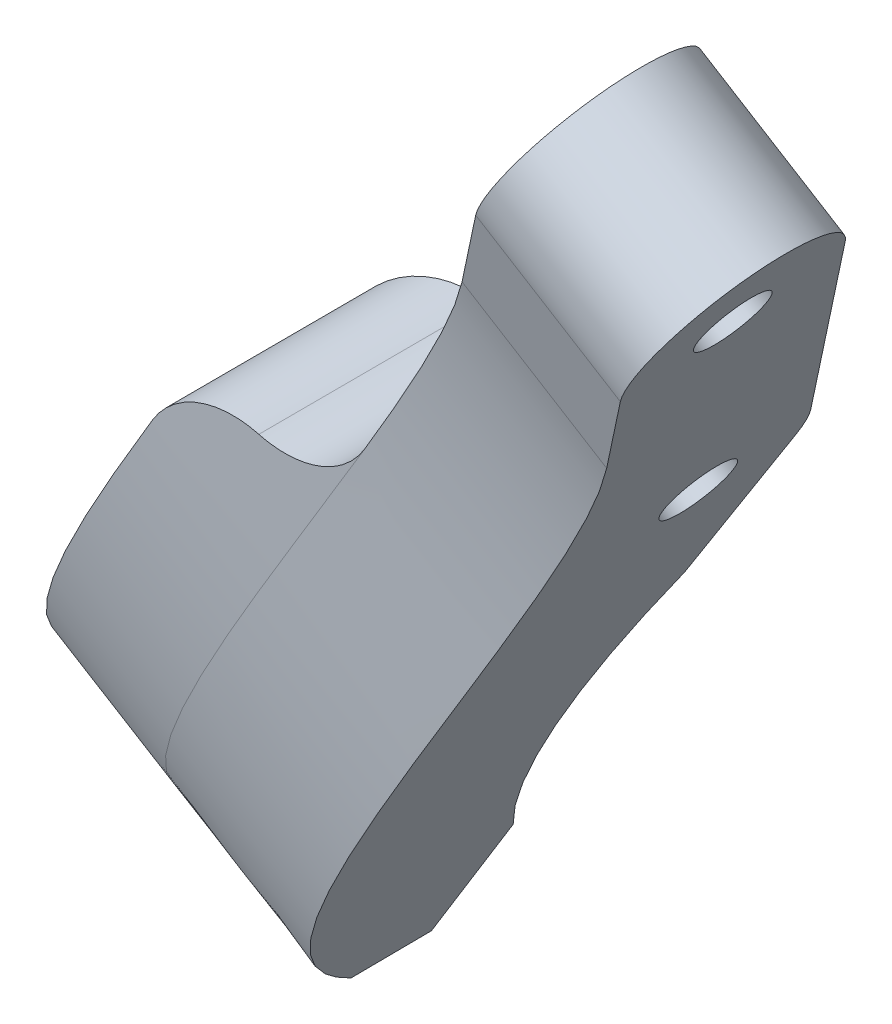
ISO-10303-21;
HEADER;
FILE_DESCRIPTION(('STEP AP214'),'2;1');
FILE_NAME('part.step','',(''),(''),'','','');
FILE_SCHEMA(('AUTOMOTIVE_DESIGN { 1 0 10303 214 1 1 1 1 }'));
ENDSEC;
DATA;
#1=APPLICATION_CONTEXT('core data for automotive mechanical design processes');
#2=APPLICATION_PROTOCOL_DEFINITION('international standard','automotive_design',2000,#1);
#3=PRODUCT_CONTEXT('',#1,'mechanical');
#4=PRODUCT('Part','Part','',(#3));
#5=PRODUCT_RELATED_PRODUCT_CATEGORY('part','',(#4));
#6=PRODUCT_DEFINITION_FORMATION('','',#4);
#7=PRODUCT_DEFINITION_CONTEXT('part definition',#1,'design');
#8=PRODUCT_DEFINITION('design','',#6,#7);
#9=PRODUCT_DEFINITION_SHAPE('','',#8);
#10=(LENGTH_UNIT() NAMED_UNIT(*) SI_UNIT(.MILLI.,.METRE.));
#11=(NAMED_UNIT(*) PLANE_ANGLE_UNIT() SI_UNIT($,.RADIAN.));
#12=(NAMED_UNIT(*) SI_UNIT($,.STERADIAN.) SOLID_ANGLE_UNIT());
#13=UNCERTAINTY_MEASURE_WITH_UNIT(LENGTH_MEASURE(1.E-05),#10,'distance_accuracy_value','');
#14=(GEOMETRIC_REPRESENTATION_CONTEXT(3) GLOBAL_UNCERTAINTY_ASSIGNED_CONTEXT((#13)) GLOBAL_UNIT_ASSIGNED_CONTEXT((#10,
#11,#12)) REPRESENTATION_CONTEXT('',''));
#15=CARTESIAN_POINT('',(0.,0.,0.));
#16=DIRECTION('',(0.,0.,1.));
#17=DIRECTION('',(1.,0.,0.));
#18=AXIS2_PLACEMENT_3D('',#15,#16,#17);
#19=CARTESIAN_POINT('',(-130.554200433423,239.583217904642,122.671598751992));
#20=DIRECTION('',(-0.849388113162932,0.527762814669667,0.00249893366544723));
#21=DIRECTION('',(-0.211719550798936,-0.345073678716443,0.914384485906557));
#22=AXIS2_PLACEMENT_3D('',#19,#20,#21);
#23=PLANE('',#22);
#24=CARTESIAN_POINT('',(-154.013629575992,202.003501121946,85.4624671745819));
#25=DIRECTION('',(-0.849388113162932,0.527762814669667,0.00249893366544723));
#26=DIRECTION('',(-0.527764462529552,-0.84939076524936,0.));
#27=AXIS2_PLACEMENT_3D('',#24,#25,#26);
#28=CIRCLE('',#27,27.2604474324299);
#29=CARTESIAN_POINT('',(-160.911886497136,190.788337321939,109.332241924361));
#30=VERTEX_POINT('',#29);
#31=CARTESIAN_POINT('',(-156.156011352684,198.427965741754,112.402358437988));
#32=VERTEX_POINT('',#31);
#33=EDGE_CURVE('E199',#30,#32,#28,.T.);
#34=ORIENTED_EDGE('',*,*,#33,.F.);
#35=CARTESIAN_POINT('',(-160.911886497136,190.788337321939,109.332241924361));
#36=CARTESIAN_POINT('',(-159.236040593308,193.47744565111,111.025848084402));
#37=CARTESIAN_POINT('',(-157.458225846282,196.333368920378,112.14817097708));
#38=CARTESIAN_POINT('',(-155.573098384083,199.365411386922,112.550579356969));
#39=CARTESIAN_POINT('',(-153.684828730079,202.402507760526,112.953658484243));
#40=CARTESIAN_POINT('',(-151.818579185044,205.407715938208,112.606731798949));
#41=CARTESIAN_POINT('',(-149.987586104914,208.359002102272,111.664195657152));
#42=(BOUNDED_CURVE() B_SPLINE_CURVE(3,(#35,#36,#37,#38,#39,#40,#41),.UNSPECIFIED.,.F.,
.F.) B_SPLINE_CURVE_WITH_KNOTS((4,3,4),(0.,1.07783386624527,2.1574643010566),
.UNSPECIFIED.) CURVE() GEOMETRIC_REPRESENTATION_ITEM() RATIONAL_B_SPLINE_CURVE((1.,1.,1.,1.,1.,
1.,1.)) REPRESENTATION_ITEM(''));
#43=EDGE_CURVE('E227',#30,#32,#42,.T.);
#44=ORIENTED_EDGE('',*,*,#43,.T.);
#45=EDGE_LOOP('',(#34,#44));
#46=FACE_BOUND('',#45,.T.);
#47=ADVANCED_FACE('F53',(#46),#23,.F.);
#48=CARTESIAN_POINT('',(-155.270675856665,199.851858432794,112.608779310906));
#49=VERTEX_POINT('',#48);
#50=CARTESIAN_POINT('',(-149.987586104914,208.359002102272,111.664195657152));
#51=VERTEX_POINT('',#50);
#52=EDGE_CURVE('E218',#49,#51,#28,.T.);
#53=ORIENTED_EDGE('',*,*,#52,.F.);
#54=EDGE_CURVE('E192',#49,#51,#42,.T.);
#55=ORIENTED_EDGE('',*,*,#54,.T.);
#56=EDGE_LOOP('',(#53,#55));
#57=FACE_BOUND('',#56,.T.);
#58=ADVANCED_FACE('F452',(#57),#23,.F.);
#59=CARTESIAN_POINT('',(-190.286535692415,120.853212919488,33.8639850190344));
#60=CARTESIAN_POINT('',(-213.300316608428,135.152704052225,33.9316924792743));
#61=CARTESIAN_POINT('',(-178.471410495353,139.743447872602,60.3005928424088));
#62=CARTESIAN_POINT('',(-201.485191411364,154.042939005339,60.3683003026487));
#63=CARTESIAN_POINT('',(-166.65628529829,158.633682825716,86.7372006657834));
#64=CARTESIAN_POINT('',(-189.670066214302,172.933173958453,86.8049081260233));
#65=CARTESIAN_POINT('',(-154.841160101227,177.523917778831,113.173808489158));
#66=CARTESIAN_POINT('',(-177.854941017239,191.823408911568,113.241515949398));
#67=CARTESIAN_POINT('',(-148.064406128636,188.358714078198,128.336947609632));
#68=CARTESIAN_POINT('',(-171.078187044648,202.658205210935,128.404655069871));
#69=CARTESIAN_POINT('',(-137.368955526914,205.615317408969,119.211079333427));
#70=CARTESIAN_POINT('',(-160.382736442926,219.914808541706,119.278786793667));
#71=CARTESIAN_POINT('',(-128.974353554221,219.092409887209,126.240825941922));
#72=CARTESIAN_POINT('',(-151.988134470234,233.391901019946,126.308533402162));
#73=(BOUNDED_SURFACE() B_SPLINE_SURFACE(3,1,((#59,#60),(#61,#62),(#63,#64),(#65,#66),(#67,#68),
(#69,#70),(#71,#72)),.UNSPECIFIED.,.F.,.F.,.F.) B_SPLINE_SURFACE_WITH_KNOTS((4,3,4),(2,2),
(-1.74347855106593,0.,1.),(-0.364727041196335,2.34472704220426),
.UNSPECIFIED.) GEOMETRIC_REPRESENTATION_ITEM() RATIONAL_B_SPLINE_SURFACE(((1.,1.),(1.,1.),(1.,
1.),(1.,1.),(1.,1.),(1.,1.),(1.,1.))) REPRESENTATION_ITEM('') SURFACE());
#74=CARTESIAN_POINT('',(-165.15890719653,183.934795401992,113.20416371212));
#75=CARTESIAN_POINT('',(-158.38215322394,194.769591701358,128.367302832613));
#76=CARTESIAN_POINT('',(-147.686702622214,212.026195032136,119.2414345564));
#77=CARTESIAN_POINT('',(-139.292100649519,225.503287510381,126.271181164898));
#78=(BOUNDED_CURVE() B_SPLINE_CURVE(3,(#74,#75,#76,#77),.UNSPECIFIED.,.F.,
.F.) B_SPLINE_CURVE_WITH_KNOTS((4,4),(10.3495563579461,25.5795672564202),
.UNSPECIFIED.) CURVE() GEOMETRIC_REPRESENTATION_ITEM() RATIONAL_B_SPLINE_CURVE((1.,1.,1.,1.)) REPRESENTATION_ITEM(''));
#79=CARTESIAN_POINT('',(-165.158907196524,183.934795402002,113.204163712134));
#80=VERTEX_POINT('',#79);
#81=CARTESIAN_POINT('',(-147.213857505538,212.768341934899,123.223726407014));
#82=VERTEX_POINT('',#81);
#83=EDGE_CURVE('E183',#80,#82,#78,.T.);
#84=CARTESIAN_POINT('',(-147.213857505537,212.768341934899,123.223726407014));
#85=CARTESIAN_POINT('',(-147.283850944044,212.655729661432,123.216113457687));
#86=CARTESIAN_POINT('',(-147.358301491458,212.54593291806,123.208758676163));
#87=CARTESIAN_POINT('',(-147.437035825369,212.439213445033,123.201658983338));
#88=CARTESIAN_POINT('',(-147.547912519714,212.288927009578,123.191660924903));
#89=CARTESIAN_POINT('',(-147.667133782602,212.144947547271,123.182182592419));
#90=CARTESIAN_POINT('',(-147.794146846982,212.007956571452,123.173200445009));
#91=CARTESIAN_POINT('',(-148.057872318591,211.723513314528,123.154550229196));
#92=CARTESIAN_POINT('',(-148.353849597899,211.470645871667,123.138133467725));
#93=CARTESIAN_POINT('',(-148.676147741597,211.254504774682,123.123604922473));
#94=CARTESIAN_POINT('',(-148.864596383759,211.128126459948,123.115110040702));
#95=CARTESIAN_POINT('',(-149.061169255766,211.014889810182,123.107298630019));
#96=CARTESIAN_POINT('',(-149.264444247249,210.915471379315,123.100092459311));
#97=CARTESIAN_POINT('',(-149.520543612538,210.790217422312,123.091013645773));
#98=CARTESIAN_POINT('',(-149.787280670521,210.686897178509,123.082893392063));
#99=CARTESIAN_POINT('',(-150.061819841548,210.606850059679,123.075619038334));
#100=CARTESIAN_POINT('',(-150.263541683566,210.548034218581,123.070274096014));
#101=CARTESIAN_POINT('',(-150.468520719753,210.50206172788,123.065411972324));
#102=CARTESIAN_POINT('',(-150.67551928881,210.469112612225,123.060996099036));
#103=CARTESIAN_POINT('',(-150.943977606605,210.426380605901,123.055269112999));
#104=CARTESIAN_POINT('',(-151.215832583991,210.40555379773,123.050291451282));
#105=CARTESIAN_POINT('',(-151.488390825583,210.40701437856,123.046028401059));
#106=CARTESIAN_POINT('',(-151.590502852519,210.407561574888,123.044431279296));
#107=CARTESIAN_POINT('',(-151.692503192694,210.411235998584,123.042938217383));
#108=CARTESIAN_POINT('',(-151.794249479963,210.418019740108,123.041547741427));
#109=CARTESIAN_POINT('',(-152.101362153134,210.438495897512,123.037350705846));
#110=CARTESIAN_POINT('',(-152.406159942504,210.487300963743,123.034084806528));
#111=CARTESIAN_POINT('',(-152.704730996739,210.563936997407,123.031746510106));
#112=(BOUNDED_CURVE() B_SPLINE_CURVE(3,(#84,#85,#86,#87,#88,#89,#90,#91,#92,#93,#94,#95,#96,#97,
#98,#99,#100,#101,#102,#103,#104,#105,#106,#107,#108,#109,#110,#111),.UNSPECIFIED.,.F.,
.F.) B_SPLINE_CURVE_WITH_KNOTS((4,3,3,3,3,3,3,3,3,4),(0.,0.0398430750700399,0.0959516142144151,
0.212453416759666,0.280572352373927,0.366393121804467,0.429451240717555,0.511231885887073,
0.541870429024245,0.634350313426785),
.UNSPECIFIED.) CURVE() GEOMETRIC_REPRESENTATION_ITEM() RATIONAL_B_SPLINE_CURVE((1.,1.,1.,1.,1.,
1.,1.,1.,1.,1.,1.,1.,1.,1.,1.,1.,1.,1.,1.,1.,1.,1.,1.,1.,1.,1.,1.,1.)) REPRESENTATION_ITEM(''));
#113=CARTESIAN_POINT('',(-152.704730996742,210.563936997408,123.031746510392));
#114=VERTEX_POINT('',#113);
#115=EDGE_CURVE('E316',#82,#114,#112,.T.);
#116=CARTESIAN_POINT('',(-158.195521071434,208.359557555514,122.862755524075));
#117=CARTESIAN_POINT('',(-158.087308357932,208.533670033716,122.872560096532));
#118=CARTESIAN_POINT('',(-157.968482703931,208.70098362137,122.881868221142));
#119=CARTESIAN_POINT('',(-157.839709468994,208.860547216873,122.890704924665));
#120=CARTESIAN_POINT('',(-157.661579320297,209.081269224883,122.902928608517));
#121=CARTESIAN_POINT('',(-157.464975130459,209.286467224217,122.914212644109));
#122=CARTESIAN_POINT('',(-157.252010304201,209.473908424981,122.924668332394));
#123=CARTESIAN_POINT('',(-157.028176928399,209.670915590288,122.935657621311));
#124=CARTESIAN_POINT('',(-156.78752724675,209.847201014708,122.945674177647));
#125=CARTESIAN_POINT('',(-156.533077814096,210.000863032419,122.954865731074));
#126=CARTESIAN_POINT('',(-156.319930686962,210.129582586961,122.962565308891));
#127=CARTESIAN_POINT('',(-156.097100247072,210.242427014383,122.969685907795));
#128=CARTESIAN_POINT('',(-155.86635687748,210.33828308965,122.976286054269));
#129=CARTESIAN_POINT('',(-155.621772867197,210.439888883743,122.983282096219));
#130=CARTESIAN_POINT('',(-155.370037462378,210.521686416567,122.989645040334));
#131=CARTESIAN_POINT('',(-155.11359653021,210.583160726023,122.995424971684));
#132=CARTESIAN_POINT('',(-154.843240414527,210.647970798962,123.001518537853));
#133=CARTESIAN_POINT('',(-154.567654269078,210.690192186124,123.006963928807));
#134=CARTESIAN_POINT('',(-154.289695315566,210.709235894572,123.011763291294));
#135=CARTESIAN_POINT('',(-154.192777716678,210.715875977482,123.013436713512));
#136=CARTESIAN_POINT('',(-154.095571568018,210.719698360453,123.015031131248));
#137=CARTESIAN_POINT('',(-153.998197756759,210.720678454418,123.016545271511));
#138=CARTESIAN_POINT('',(-153.663352941678,210.724048758796,123.021752031006));
#139=CARTESIAN_POINT('',(-153.329823636126,210.693770819985,123.025962582469));
#140=CARTESIAN_POINT('',(-153.002562319212,210.630764953076,123.02913468283));
#141=CARTESIAN_POINT('',(-152.902654235972,210.611530185414,123.030103078576));
#142=CARTESIAN_POINT('',(-152.803330230266,210.589245355389,123.030974326721));
#143=CARTESIAN_POINT('',(-152.704730996739,210.563936997407,123.031746510106));
#144=(BOUNDED_CURVE() B_SPLINE_CURVE(3,(#116,#117,#118,#119,#120,#121,#122,#123,#124,#125,#126,
#127,#128,#129,#130,#131,#132,#133,#134,#135,#136,#137,#138,#139,#140,#141,#142,#143),
.UNSPECIFIED.,.F.,.F.) B_SPLINE_CURVE_WITH_KNOTS((4,3,3,3,3,3,3,3,3,4),(0.,0.0615704056046904,
0.146739854915798,0.23625588293517,0.311241643389466,0.39072526208924,0.474521878449434,
0.503739742274043,0.604212904468515,0.634885888206467),
.UNSPECIFIED.) CURVE() GEOMETRIC_REPRESENTATION_ITEM() RATIONAL_B_SPLINE_CURVE((1.,1.,1.,1.,1.,
1.,1.,1.,1.,1.,1.,1.,1.,1.,1.,1.,1.,1.,1.,1.,1.,1.,1.,1.,1.,1.,1.,1.)) REPRESENTATION_ITEM(''));
#145=CARTESIAN_POINT('',(-158.195521071451,208.359557555488,122.862755524073));
#146=VERTEX_POINT('',#145);
#147=EDGE_CURVE('E310',#146,#114,#144,.T.);
#148=CARTESIAN_POINT('',(-158.19552107145,208.359557555489,122.862755524073));
#149=CARTESIAN_POINT('',(-162.976010231635,200.667829035189,122.429621090652));
#150=CARTESIAN_POINT('',(-167.572574565613,193.276239333769,121.124696110052));
#151=CARTESIAN_POINT('',(-171.104623988664,187.62913510469,113.221656247792));
#152=(BOUNDED_CURVE() B_SPLINE_CURVE(3,(#148,#149,#150,#151),.UNSPECIFIED.,.F.,
.F.) B_SPLINE_CURVE_WITH_KNOTS((4,4),(2.48893102353375,5.55049235151534),
.UNSPECIFIED.) CURVE() GEOMETRIC_REPRESENTATION_ITEM() RATIONAL_B_SPLINE_CURVE((1.,1.,1.,1.)) REPRESENTATION_ITEM(''));
#153=CARTESIAN_POINT('',(-171.104623988664,187.62913510469,113.221656247792));
#154=VERTEX_POINT('',#153);
#155=EDGE_CURVE('E342',#146,#154,#152,.T.);
#156=DIRECTION('',(-0.849388113162932,0.527762814669667,0.00249893366544723));
#157=VECTOR('',#156,1.);
#158=CARTESIAN_POINT('',(-157.939108234639,179.448811477309,113.182922775977));
#159=LINE('',#158,#157);
#160=EDGE_CURVE('E223',#80,#154,#159,.T.);
#161=ORIENTED_EDGE('',*,*,#83,.T.);
#162=ORIENTED_EDGE('',*,*,#115,.T.);
#163=ORIENTED_EDGE('',*,*,#147,.F.);
#164=ORIENTED_EDGE('',*,*,#155,.T.);
#165=ORIENTED_EDGE('',*,*,#160,.F.);
#166=EDGE_LOOP('',(#161,#162,#163,#164,#165));
#167=FACE_BOUND('',#166,.T.);
#168=ADVANCED_FACE('F390',(#167),#73,.T.);
#169=CARTESIAN_POINT('',(-157.992101957811,179.323652955737,121.603224355627));
#170=DIRECTION('',(-0.527731214315172,-0.849261757925097,-0.0159446531291126));
#171=DIRECTION('',(0.849388113162932,-0.527762814669667,-0.00249893366544723));
#172=AXIS2_PLACEMENT_3D('',#169,#170,#171);
#173=PLANE('',#172);
#174=DIRECTION('',(-0.849388113162932,0.527762814669667,0.00249893366544723));
#175=VECTOR('',#174,1.);
#176=CARTESIAN_POINT('',(-157.913937249772,179.508259333846,109.183443763172));
#177=LINE('',#176,#175);
#178=CARTESIAN_POINT('',(-157.913937249779,179.508259333836,109.183443763171));
#179=VERTEX_POINT('',#178);
#180=CARTESIAN_POINT('',(-171.079453003797,187.688582961226,109.222177234986));
#181=VERTEX_POINT('',#180);
#182=EDGE_CURVE('E164',#179,#181,#177,.T.);
#183=ORIENTED_EDGE('',*,*,#182,.F.);
#184=DIRECTION('',(0.00629274621669123,0.0148619641341267,-0.99986975320145));
#185=VECTOR('',#184,1.);
#186=CARTESIAN_POINT('',(-157.913937249779,179.508259333836,109.183443763171));
#187=LINE('',#186,#185);
#188=CARTESIAN_POINT('',(-157.939108234646,179.4488114773,113.182922775964));
#189=VERTEX_POINT('',#188);
#190=EDGE_CURVE('E157',#189,#179,#187,.T.);
#191=ORIENTED_EDGE('',*,*,#190,.F.);
#192=DIRECTION('',(-0.849388113162932,0.527762814669667,0.00249893366544723));
#193=VECTOR('',#192,1.);
#194=CARTESIAN_POINT('',(-157.939108234646,179.4488114773,113.182922775964));
#195=LINE('',#194,#193);
#196=EDGE_CURVE('E162',#189,#80,#195,.T.);
#197=ORIENTED_EDGE('',*,*,#196,.T.);
#198=ORIENTED_EDGE('',*,*,#160,.T.);
#199=DIRECTION('',(-0.00629274621669648,-0.0148619641341345,0.99986975320145));
#200=VECTOR('',#199,1.);
#201=CARTESIAN_POINT('',(-171.079228453541,187.68911329532,109.186497898481));
#202=LINE('',#201,#200);
#203=EDGE_CURVE('E268',#181,#154,#202,.T.);
#204=ORIENTED_EDGE('',*,*,#203,.F.);
#205=EDGE_LOOP('',(#183,#191,#197,#198,#204));
#206=FACE_BOUND('',#205,.T.);
#207=ADVANCED_FACE('F161',(#206),#173,.T.);
#208=CARTESIAN_POINT('',(-123.2562367635,235.281840358059,110.230577223381));
#209=DIRECTION('',(0.00629274621669601,0.0148619641341338,-0.99986975320145));
#210=DIRECTION('',(-0.527731214315172,-0.849261757925097,-0.0159446531291126));
#211=AXIS2_PLACEMENT_3D('',#208,#209,#210);
#212=PLANE('',#211);
#213=DIRECTION('',(0.849388113162934,-0.527762814669664,-0.00249893366545467));
#214=VECTOR('',#213,1.);
#215=CARTESIAN_POINT('',(-154.541475648414,186.830116211917,109.31349992187));
#216=LINE('',#215,#214);
#217=CARTESIAN_POINT('',(-166.857603289276,194.482677024626,109.349734460019));
#218=VERTEX_POINT('',#217);
#219=EDGE_CURVE('E329',#218,#30,#216,.T.);
#220=ORIENTED_EDGE('',*,*,#219,.T.);
#221=DIRECTION('',(-0.849388113162932,0.527762814669667,0.00249893366544723));
#222=VECTOR('',#221,1.);
#223=CARTESIAN_POINT('',(-153.692087535251,186.302353397247,109.311000988204));
#224=LINE('',#223,#222);
#225=CARTESIAN_POINT('',(-153.692087535251,186.302353397247,109.311000988204));
#226=VERTEX_POINT('',#225);
#227=EDGE_CURVE('E189',#226,#30,#224,.T.);
#228=ORIENTED_EDGE('',*,*,#227,.F.);
#229=DIRECTION('',(0.527731214315173,0.849261757925097,0.0159446531291005));
#230=VECTOR('',#229,1.);
#231=CARTESIAN_POINT('',(-153.692087535251,186.302353397247,109.311000988204));
#232=LINE('',#231,#230);
#233=EDGE_CURVE('E166',#179,#226,#232,.T.);
#234=ORIENTED_EDGE('',*,*,#233,.F.);
#235=ORIENTED_EDGE('',*,*,#182,.T.);
#236=DIRECTION('',(-0.527731214315173,-0.849261757925096,-0.0159446531291126));
#237=VECTOR('',#236,1.);
#238=CARTESIAN_POINT('',(-151.550922225677,219.115252311915,109.812204205027));
#239=LINE('',#238,#237);
#240=EDGE_CURVE('E269',#218,#181,#239,.T.);
#241=ORIENTED_EDGE('',*,*,#240,.F.);
#242=EDGE_LOOP('',(#220,#228,#234,#235,#241));
#243=FACE_BOUND('',#242,.T.);
#244=ADVANCED_FACE('F404',(#243),#212,.T.);
#245=CARTESIAN_POINT('',(-123.588825293944,234.745940403261,110.363163452912));
#246=DIRECTION('',(-0.0206935315705588,-0.0285724216035948,-0.999377503486468));
#247=DIRECTION('',(-0.527362883571315,-0.848911083786552,0.0351903517415067));
#248=AXIS2_PLACEMENT_3D('',#245,#246,#247);
#249=PLANE('',#248);
#250=DIRECTION('',(0.527362883571316,0.848911083786551,-0.0351903517414916));
#251=VECTOR('',#250,1.);
#252=CARTESIAN_POINT('',(-144.162877572555,217.735201654769,111.27551919085));
#253=LINE('',#252,#251);
#254=CARTESIAN_POINT('',(-147.256489298756,212.755326572323,111.481952537201));
#255=VERTEX_POINT('',#254);
#256=CARTESIAN_POINT('',(-144.769157892809,216.759254920976,111.315975617323));
#257=VERTEX_POINT('',#256);
#258=EDGE_CURVE('E202',#255,#257,#253,.T.);
#259=ORIENTED_EDGE('',*,*,#258,.T.);
#260=DIRECTION('',(-0.849388113162932,0.527762814669667,0.00249893366544718));
#261=VECTOR('',#260,1.);
#262=CARTESIAN_POINT('',(-137.549358930925,212.273270996284,111.294734681167));
#263=LINE('',#262,#261);
#264=CARTESIAN_POINT('',(-137.549358930925,212.273270996284,111.294734681167));
#265=VERTEX_POINT('',#264);
#266=EDGE_CURVE('E65',#257,#265,#263,.F.);
#267=ORIENTED_EDGE('',*,*,#266,.T.);
#268=DIRECTION('',(0.527362883571316,0.848911083786551,-0.0351903517414916));
#269=VECTOR('',#268,1.);
#270=CARTESIAN_POINT('',(-136.943078610671,213.249217730077,111.254278254694));
#271=LINE('',#270,#269);
#272=CARTESIAN_POINT('',(-142.767787143029,203.87301817758,111.642954720996));
#273=VERTEX_POINT('',#272);
#274=EDGE_CURVE('E411',#273,#265,#271,.T.);
#275=ORIENTED_EDGE('',*,*,#274,.F.);
#276=DIRECTION('',(-0.849388113162932,0.527762814669667,0.00249893366544723));
#277=VECTOR('',#276,1.);
#278=CARTESIAN_POINT('',(-142.767787143029,203.87301817758,111.642954720996));
#279=LINE('',#278,#277);
#280=EDGE_CURVE('E198',#273,#51,#279,.T.);
#281=ORIENTED_EDGE('',*,*,#280,.T.);
#282=DIRECTION('',(0.849388113162934,-0.527762814669664,-0.00249893366545467));
#283=VECTOR('',#282,1.);
#284=CARTESIAN_POINT('',(-143.617175256192,204.40078099225,111.645453654661));
#285=LINE('',#284,#283);
#286=CARTESIAN_POINT('',(-153.760234578713,210.703117291119,111.675294939251));
#287=VERTEX_POINT('',#286);
#288=EDGE_CURVE('E334',#287,#51,#285,.T.);
#289=ORIENTED_EDGE('',*,*,#288,.F.);
#290=CARTESIAN_POINT('',(-153.988618710969,205.708519934407,111.822820589121));
#291=DIRECTION('',(0.0206935315705588,0.0285724216035948,0.999377503486468));
#292=DIRECTION('',(0.527362883571316,0.848911083786551,-0.0351903517415067));
#293=AXIS2_PLACEMENT_3D('',#290,#291,#292);
#294=ELLIPSE('',#293,5.00261583342777,5.);
#295=CARTESIAN_POINT('',(-152.74602428777,210.551330290039,111.658633897324));
#296=VERTEX_POINT('',#295);
#297=EDGE_CURVE('E238',#296,#287,#294,.T.);
#298=ORIENTED_EDGE('',*,*,#297,.F.);
#299=CARTESIAN_POINT('',(-151.503429864571,215.394140645671,111.494447205528));
#300=DIRECTION('',(-0.0206935315705588,-0.0285724216035948,-0.999377503486468));
#301=DIRECTION('',(0.527362883571315,0.848911083786552,-0.0351903517415067));
#302=AXIS2_PLACEMENT_3D('',#299,#300,#301);
#303=ELLIPSE('',#302,5.00261583342777,5.);
#304=EDGE_CURVE('E261',#255,#296,#303,.T.);
#305=ORIENTED_EDGE('',*,*,#304,.F.);
#306=EDGE_LOOP('',(#259,#267,#275,#281,#289,#298,#305));
#307=FACE_BOUND('',#306,.T.);
#308=ADVANCED_FACE('F450',(#307),#249,.T.);
#309=CARTESIAN_POINT('',(-137.999577764616,210.373112762611,109.460149059885));
#310=CARTESIAN_POINT('',(-151.69596689904,218.883291758968,109.500444382332));
#311=CARTESIAN_POINT('',(-139.412023097287,208.096462777941,110.187230330044));
#312=CARTESIAN_POINT('',(-153.108412231711,216.606641774298,110.227525652492));
#313=CARTESIAN_POINT('',(-140.824468429958,205.819812793271,110.914311600203));
#314=CARTESIAN_POINT('',(-154.520857564383,214.329991789629,110.954606922651));
#315=CARTESIAN_POINT('',(-142.236913762629,203.543162808602,111.641392870363));
#316=CARTESIAN_POINT('',(-155.933302897054,212.053341804959,111.68168819281));
#317=CARTESIAN_POINT('',(-144.06790684276,200.591876644538,112.583929012159));
#318=CARTESIAN_POINT('',(-157.764295977184,209.102055640896,112.624224334607));
#319=CARTESIAN_POINT('',(-145.934156387795,197.586668466856,112.930855697454));
#320=CARTESIAN_POINT('',(-159.630545522219,206.096847463213,112.971151019901));
#321=CARTESIAN_POINT('',(-149.707553503998,191.517529626709,112.12536819029));
#322=CARTESIAN_POINT('',(-163.403942638422,200.027708623065,112.165663512738));
#323=CARTESIAN_POINT('',(-151.485368251023,188.66160635744,111.003045297613));
#324=CARTESIAN_POINT('',(-165.181757385448,197.171785353798,111.04334062006));
#325=CARTESIAN_POINT('',(-153.161214154852,185.972498028269,109.309439137571));
#326=CARTESIAN_POINT('',(-166.857603289276,194.482677024626,109.349734460019));
#327=CARTESIAN_POINT('',(-154.456125718656,183.894647395457,108.000804378159));
#328=CARTESIAN_POINT('',(-168.15251485308,192.404826391814,108.041099700607));
#329=CARTESIAN_POINT('',(-155.75103728246,181.816796762644,106.692169618747));
#330=CARTESIAN_POINT('',(-169.447426416884,190.326975759001,106.732464941194));
#331=CARTESIAN_POINT('',(-157.045948846264,179.73894612983,105.383534859335));
#332=CARTESIAN_POINT('',(-170.742337980689,188.249125126188,105.423830181782));
#333=(BOUNDED_SURFACE() B_SPLINE_SURFACE(3,1,((#309,#310),(#311,#312),(#313,#314),(#315,#316),
(#317,#318),(#319,#320),(#321,#322),(#323,#324),(#325,#326),(#327,#328),(#329,#330),(#331,
#332)),.UNSPECIFIED.,.F.,.F.,.F.) B_SPLINE_SURFACE_WITH_KNOTS((4,3,2,3,4),(2,2),
(-0.832832860153063,0.,1.07962493738539,2.15745331535274,2.99028193476117),(-0.81250068398321,
0.8),.UNSPECIFIED.) GEOMETRIC_REPRESENTATION_ITEM() RATIONAL_B_SPLINE_SURFACE(((1.,1.),(1.,1.),
(1.,1.),(1.,1.),(1.,1.),(1.,1.),(1.,1.),(1.,1.),(1.,1.),(1.,1.),(1.,1.),(1.,1.))) REPRESENTATION_ITEM('') SURFACE());
#334=CARTESIAN_POINT('',(-158.23301170134,208.348111563676,112.537020637791));
#335=CARTESIAN_POINT('',(-159.318994877861,206.599151686704,112.783040046646));
#336=CARTESIAN_POINT('',(-160.415143700162,204.834898315267,112.803666917112));
#337=CARTESIAN_POINT('',(-161.518815176223,203.05975108961,112.568071892628));
#338=CARTESIAN_POINT('',(-163.403942638422,200.027708623065,112.165663512738));
#339=CARTESIAN_POINT('',(-165.181757385448,197.171785353798,111.04334062006));
#340=CARTESIAN_POINT('',(-166.857603289276,194.482677024626,109.349734460019));
#341=(BOUNDED_CURVE() B_SPLINE_CURVE(3,(#334,#335,#336,#337,#338,#339,#340),.UNSPECIFIED.,.F.,
.F.) B_SPLINE_CURVE_WITH_KNOTS((4,3,4),(0.448596818223151,1.07962493738539,2.15745331535274),
.UNSPECIFIED.) CURVE() GEOMETRIC_REPRESENTATION_ITEM() RATIONAL_B_SPLINE_CURVE((1.,1.,1.,1.,1.,
1.,1.)) REPRESENTATION_ITEM(''));
#342=CARTESIAN_POINT('',(-158.233011529629,208.348111827558,112.537023271703));
#343=VERTEX_POINT('',#342);
#344=EDGE_CURVE('E215',#343,#218,#341,.T.);
#345=CARTESIAN_POINT('',(-153.760234578713,210.703117291119,111.675294939251));
#346=CARTESIAN_POINT('',(-154.000023821842,210.714147421346,111.707619826162));
#347=CARTESIAN_POINT('',(-154.239490245543,210.707851670568,111.743175752659));
#348=CARTESIAN_POINT('',(-154.476838940812,210.684599707607,111.781062665259));
#349=CARTESIAN_POINT('',(-154.786053463766,210.654307379155,111.830421199092));
#350=CARTESIAN_POINT('',(-155.091674025196,210.595235539212,111.883734333192));
#351=CARTESIAN_POINT('',(-155.389732729959,210.50820053942,111.938917458502));
#352=CARTESIAN_POINT('',(-155.421727966174,210.498857730998,111.944841114148));
#353=CARTESIAN_POINT('',(-155.453636063726,210.489192707193,111.950786273026));
#354=CARTESIAN_POINT('',(-155.485452111608,210.479206482626,111.956750334594));
#355=CARTESIAN_POINT('',(-155.708995198974,210.409042159284,111.998654493815));
#356=CARTESIAN_POINT('',(-155.926972983693,210.323342093105,112.041296447136));
#357=CARTESIAN_POINT('',(-156.137838038373,210.222875788602,112.083778046627));
#358=CARTESIAN_POINT('',(-156.325751220871,210.133344865418,112.121635682972));
#359=CARTESIAN_POINT('',(-156.508015781728,210.032087280943,112.15936556107));
#360=CARTESIAN_POINT('',(-156.683533065661,209.919653094715,112.196372848262));
#361=CARTESIAN_POINT('',(-156.8037144814,209.842666376508,112.22171273541));
#362=CARTESIAN_POINT('',(-156.920732358282,209.760439608156,112.246714658966));
#363=CARTESIAN_POINT('',(-157.03423292426,209.673151025224,112.271201872707));
#364=CARTESIAN_POINT('',(-157.180663003622,209.560537717829,112.302793474216));
#365=CARTESIAN_POINT('',(-157.320687525922,209.439927629225,112.333406402009));
#366=CARTESIAN_POINT('',(-157.453680614382,209.311879122236,112.362722856816));
#367=CARTESIAN_POINT('',(-157.582834924672,209.187526670575,112.391193106998));
#368=CARTESIAN_POINT('',(-157.705357850578,209.056159031798,112.418440537224));
#369=CARTESIAN_POINT('',(-157.82067339364,208.918291828031,112.444222468684));
#370=CARTESIAN_POINT('',(-157.915142245402,208.805348194504,112.46534355433));
#371=CARTESIAN_POINT('',(-158.004774011795,208.688042637214,112.485481929963));
#372=CARTESIAN_POINT('',(-158.089250635957,208.566660732726,112.504530209294));
#373=CARTESIAN_POINT('',(-158.139088893858,208.495049648355,112.515768028836));
#374=CARTESIAN_POINT('',(-158.187023097513,208.4221744385,112.526602455937));
#375=CARTESIAN_POINT('',(-158.23301170134,208.348111563676,112.537020637791));
#376=(BOUNDED_CURVE() B_SPLINE_CURVE(3,(#345,#346,#347,#348,#349,#350,#351,#352,#353,#354,#355,
#356,#357,#358,#359,#360,#361,#362,#363,#364,#365,#366,#367,#368,#369,#370,#371,#372,#373,#374,
#375),.UNSPECIFIED.,.F.,.F.) B_SPLINE_CURVE_WITH_KNOTS((4,3,3,3,3,3,3,3,3,3,4),
(-2.65275460323676,-2.5800916204242,-2.48542731421757,-2.47526553470972,-2.40386774285291,
-2.34024133348153,-2.29667461580356,-2.24046804209924,-2.18588384268977,-2.14116734996292,
-2.11478608798315),
.UNSPECIFIED.) CURVE() GEOMETRIC_REPRESENTATION_ITEM() RATIONAL_B_SPLINE_CURVE((1.,1.,1.,1.,1.,
1.,1.,1.,1.,1.,1.,1.,1.,1.,1.,1.,1.,1.,1.,1.,1.,1.,1.,1.,1.,1.,1.,1.,1.,1.,1.)) REPRESENTATION_ITEM(''));
#377=EDGE_CURVE('E248',#287,#343,#376,.T.);
#378=CARTESIAN_POINT('',(-145.7502501069,215.188952056281,109.482951846674));
#379=CARTESIAN_POINT('',(-147.162695439571,212.912302071611,110.210033116834));
#380=CARTESIAN_POINT('',(-148.575140772243,210.635652086942,110.937114386993));
#381=CARTESIAN_POINT('',(-149.987586104914,208.359002102272,111.664195657152));
#382=CARTESIAN_POINT('',(-151.818579185044,205.407715938208,112.606731798949));
#383=CARTESIAN_POINT('',(-153.684828730079,202.402507760526,112.953658484243));
#384=CARTESIAN_POINT('',(-157.458225846282,196.333368920378,112.14817097708));
#385=CARTESIAN_POINT('',(-159.236040593308,193.47744565111,111.025848084402));
#386=CARTESIAN_POINT('',(-160.911886497136,190.788337321939,109.332241924361));
#387=CARTESIAN_POINT('',(-162.20679806094,188.710486689127,108.023607164948));
#388=CARTESIAN_POINT('',(-163.501709624744,186.632636056314,106.714972405536));
#389=CARTESIAN_POINT('',(-164.796621188549,184.554785423501,105.406337646124));
#390=(BOUNDED_CURVE() B_SPLINE_CURVE(3,(#378,#379,#380,#381,#382,#383,#384,#385,#386,#387,#388,
#389),.UNSPECIFIED.,.F.,.F.) B_SPLINE_CURVE_WITH_KNOTS((4,3,2,3,4),(-0.832832860153063,0.,
1.07962493738539,2.15745331535274,2.99028193476117),
.UNSPECIFIED.) CURVE() GEOMETRIC_REPRESENTATION_ITEM() RATIONAL_B_SPLINE_CURVE((1.,1.,1.,1.,1.,
1.,1.,1.,1.,1.,1.,1.)) REPRESENTATION_ITEM(''));
#391=EDGE_CURVE('E231',#32,#49,#390,.F.);
#392=ORIENTED_EDGE('',*,*,#43,.F.);
#393=ORIENTED_EDGE('',*,*,#219,.F.);
#394=ORIENTED_EDGE('',*,*,#344,.F.);
#395=ORIENTED_EDGE('',*,*,#377,.F.);
#396=ORIENTED_EDGE('',*,*,#288,.T.);
#397=ORIENTED_EDGE('',*,*,#54,.F.);
#398=ORIENTED_EDGE('',*,*,#391,.F.);
#399=EDGE_LOOP('',(#392,#393,#394,#395,#396,#397,#398));
#400=FACE_BOUND('',#399,.T.);
#401=ADVANCED_FACE('F405',(#400),#333,.T.);
#402=CARTESIAN_POINT('',(-166.601478125278,194.954007684688,96.8639584493925));
#403=DIRECTION('',(0.849388113162932,-0.527762814669669,-0.00249893366544727));
#404=DIRECTION('',(0.483440446205126,0.776138240076503,0.404839186917396));
#405=AXIS2_PLACEMENT_3D('',#402,#403,#404);
#406=PLANE('',#405);
#407=DIRECTION('',(0.00363075345394351,0.00110845847811147,0.99999279444862));
#408=VECTOR('',#407,1.);
#409=CARTESIAN_POINT('',(-158.242438172419,208.345233900909,109.940709590492));
#410=LINE('',#409,#408);
#411=EDGE_CURVE('E312',#343,#146,#410,.T.);
#412=ORIENTED_EDGE('',*,*,#411,.F.);
#413=ORIENTED_EDGE('',*,*,#344,.T.);
#414=ORIENTED_EDGE('',*,*,#240,.T.);
#415=ORIENTED_EDGE('',*,*,#203,.T.);
#416=ORIENTED_EDGE('',*,*,#155,.F.);
#417=EDGE_LOOP('',(#412,#413,#414,#415,#416));
#418=FACE_BOUND('',#417,.T.);
#419=ADVANCED_FACE('F388',(#418),#406,.F.);
#420=CARTESIAN_POINT('',(-153.995497606604,205.706419827561,109.928214922165));
#421=DIRECTION('',(-0.00363075345394348,-0.00110845847811147,-0.99999279444862));
#422=DIRECTION('',(-0.227428077227488,0.973794847663629,-0.000253677705804145));
#423=AXIS2_PLACEMENT_3D('',#420,#421,#422);
#424=CYLINDRICAL_SURFACE('',#423,5.);
#425=DIRECTION('',(0.00363075345394348,0.00110845847811147,0.99999279444862));
#426=VECTOR('',#425,1.);
#427=CARTESIAN_POINT('',(-152.752342936724,210.549401224876,109.91833301906));
#428=LINE('',#427,#426);
#429=EDGE_CURVE('E270',#296,#114,#428,.T.);
#430=ORIENTED_EDGE('',*,*,#429,.F.);
#431=ORIENTED_EDGE('',*,*,#297,.T.);
#432=ORIENTED_EDGE('',*,*,#377,.T.);
#433=ORIENTED_EDGE('',*,*,#411,.T.);
#434=ORIENTED_EDGE('',*,*,#147,.T.);
#435=EDGE_LOOP('',(#430,#431,#432,#433,#434));
#436=FACE_BOUND('',#435,.T.);
#437=ADVANCED_FACE('F535',(#436),#424,.T.);
#438=CARTESIAN_POINT('',(-151.509188266843,215.392382622191,109.908451115955));
#439=DIRECTION('',(-0.00363075345394348,-0.00110845847811147,-0.99999279444862));
#440=DIRECTION('',(-0.849388113162932,0.527762814669667,0.00249893366544723));
#441=AXIS2_PLACEMENT_3D('',#438,#439,#440);
#442=CYLINDRICAL_SURFACE('',#441,5.);
#443=ORIENTED_EDGE('',*,*,#304,.T.);
#444=ORIENTED_EDGE('',*,*,#429,.T.);
#445=ORIENTED_EDGE('',*,*,#115,.F.);
#446=DIRECTION('',(-0.00363075345394348,-0.00110845847811147,-0.99999279444862));
#447=VECTOR('',#446,1.);
#448=CARTESIAN_POINT('',(-147.262247701029,212.753568548844,109.895956447628));
#449=LINE('',#448,#447);
#450=EDGE_CURVE('E250',#82,#255,#449,.T.);
#451=ORIENTED_EDGE('',*,*,#450,.T.);
#452=EDGE_LOOP('',(#443,#444,#445,#451));
#453=FACE_BOUND('',#452,.T.);
#454=ADVANCED_FACE('F506',(#453),#442,.F.);
#455=CARTESIAN_POINT('',(-132.072301687634,221.017303585689,126.249940228742));
#456=CARTESIAN_POINT('',(-140.466903660329,207.540211107444,119.220193620244));
#457=CARTESIAN_POINT('',(-151.162354262055,190.283607776666,128.346061896456));
#458=CARTESIAN_POINT('',(-157.939108234646,179.4488114773,113.182922775964));
#459=B_SPLINE_CURVE_WITH_KNOTS('',3,(#455,#456,#457,#458),.UNSPECIFIED.,.F.,.F.,(4,4),(0.,1.),.UNSPECIFIED.);
#460=DIRECTION('',(-0.849388113162932,0.527762814669667,0.00249893366544723));
#461=VECTOR('',#460,1.);
#462=SURFACE_OF_LINEAR_EXTRUSION('',#459,#461);
#463=CARTESIAN_POINT('',(-139.292100649519,225.503287510381,126.271181164898));
#464=CARTESIAN_POINT('',(-147.686702622214,212.026195032136,119.2414345564));
#465=CARTESIAN_POINT('',(-158.38215322394,194.769591701358,128.367302832613));
#466=CARTESIAN_POINT('',(-165.15890719653,183.934795401992,113.20416371212));
#467=B_SPLINE_CURVE_WITH_KNOTS('',3,(#463,#464,#465,#466),.UNSPECIFIED.,.F.,.F.,(4,4),(0.,1.),.UNSPECIFIED.);
#468=CARTESIAN_POINT('',(-139.292100649519,225.503287510381,126.271181164898));
#469=VERTEX_POINT('',#468);
#470=EDGE_CURVE('E206',#469,#82,#467,.T.);
#471=ORIENTED_EDGE('',*,*,#470,.T.);
#472=ORIENTED_EDGE('',*,*,#83,.F.);
#473=ORIENTED_EDGE('',*,*,#196,.F.);
#474=CARTESIAN_POINT('',(-132.072301687634,221.017303585689,126.249940228742));
#475=VERTEX_POINT('',#474);
#476=EDGE_CURVE('E168',#475,#189,#459,.T.);
#477=ORIENTED_EDGE('',*,*,#476,.F.);
#478=DIRECTION('',(-0.849388113162932,0.527762814669667,0.00249893366544723));
#479=VECTOR('',#478,1.);
#480=CARTESIAN_POINT('',(-132.072301687634,221.017303585689,126.249940228742));
#481=LINE('',#480,#479);
#482=EDGE_CURVE('E421',#475,#469,#481,.T.);
#483=ORIENTED_EDGE('',*,*,#482,.T.);
#484=EDGE_LOOP('',(#471,#472,#473,#477,#483));
#485=FACE_BOUND('',#484,.T.);
#486=ADVANCED_FACE('F184',(#485),#462,.F.);
#487=CARTESIAN_POINT('',(-146.793830614107,197.517517197254,85.4412262384256));
#488=DIRECTION('',(-0.849388113162932,0.527762814669667,0.00249893366544723));
#489=DIRECTION('',(-0.527764462529552,-0.84939076524936,0.));
#490=AXIS2_PLACEMENT_3D('',#487,#488,#489);
#491=CYLINDRICAL_SURFACE('',#490,27.2604474324299);
#492=ORIENTED_EDGE('',*,*,#33,.T.);
#493=ORIENTED_EDGE('',*,*,#391,.T.);
#494=ORIENTED_EDGE('',*,*,#52,.T.);
#495=ORIENTED_EDGE('',*,*,#280,.F.);
#496=CARTESIAN_POINT('',(-146.793830614107,197.517517197254,85.4412262384256));
#497=DIRECTION('',(-0.849388113162932,0.527762814669667,0.00249893366544723));
#498=DIRECTION('',(-0.527764462529552,-0.84939076524936,0.));
#499=AXIS2_PLACEMENT_3D('',#496,#497,#498);
#500=CIRCLE('',#499,27.2604474324299);
#501=EDGE_CURVE('E409',#226,#273,#500,.T.);
#502=ORIENTED_EDGE('',*,*,#501,.F.);
#503=ORIENTED_EDGE('',*,*,#227,.T.);
#504=EDGE_LOOP('',(#492,#493,#494,#495,#502,#503));
#505=FACE_BOUND('',#504,.T.);
#506=ADVANCED_FACE('F448',(#505),#491,.F.);
#507=CARTESIAN_POINT('',(-125.751603702564,231.216542779568,120.626161881249));
#508=DIRECTION('',(-0.211719550798936,-0.345073678716443,0.914384485906556));
#509=DIRECTION('',(0.,-0.935593969008313,-0.353077789099332));
#510=AXIS2_PLACEMENT_3D('',#507,#508,#509);
#511=PLANE('',#510);
#512=DIRECTION('',(0.483440446205125,0.776138240076503,0.404839186917396));
#513=VECTOR('',#512,1.);
#514=CARTESIAN_POINT('',(-125.751603702564,231.216542779568,120.626161881249));
#515=LINE('',#514,#513);
#516=CARTESIAN_POINT('',(-136.387293519077,214.141501497885,111.719699769066));
#517=VERTEX_POINT('',#516);
#518=CARTESIAN_POINT('',(-125.751603702564,231.216542779568,120.626161881249));
#519=VERTEX_POINT('',#518);
#520=EDGE_CURVE('E418',#517,#519,#515,.T.);
#521=ORIENTED_EDGE('',*,*,#520,.F.);
#522=DIRECTION('',(-0.849388113162932,0.527762814669667,0.00249893366544716));
#523=VECTOR('',#522,1.);
#524=CARTESIAN_POINT('',(-143.607092480962,218.627485422577,111.740940705223));
#525=LINE('',#524,#523);
#526=CARTESIAN_POINT('',(-143.607092480962,218.627485422577,111.740940705223));
#527=VERTEX_POINT('',#526);
#528=EDGE_CURVE('E221',#517,#527,#525,.T.);
#529=ORIENTED_EDGE('',*,*,#528,.T.);
#530=DIRECTION('',(0.483440446205125,0.776138240076503,0.404839186917396));
#531=VECTOR('',#530,1.);
#532=CARTESIAN_POINT('',(-132.971402664449,235.70252670426,120.647402817405));
#533=LINE('',#532,#531);
#534=CARTESIAN_POINT('',(-132.971402664449,235.70252670426,120.647402817405));
#535=VERTEX_POINT('',#534);
#536=EDGE_CURVE('E435',#527,#535,#533,.T.);
#537=ORIENTED_EDGE('',*,*,#536,.T.);
#538=DIRECTION('',(-0.849388113162932,0.527762814669667,0.00249893366544723));
#539=VECTOR('',#538,1.);
#540=CARTESIAN_POINT('',(-125.751603702564,231.216542779568,120.626161881249));
#541=LINE('',#540,#539);
#542=EDGE_CURVE('E444',#519,#535,#541,.T.);
#543=ORIENTED_EDGE('',*,*,#542,.F.);
#544=EDGE_LOOP('',(#521,#529,#537,#543));
#545=FACE_BOUND('',#544,.T.);
#546=ADVANCED_FACE('F570',(#545),#511,.F.);
#547=CARTESIAN_POINT('',(-126.810201456559,229.491174385985,125.198084310782));
#548=DIRECTION('',(-0.849388113162932,0.527762814669667,0.00249893366544723));
#549=DIRECTION('',(-0.527764462529552,-0.84939076524936,0.));
#550=AXIS2_PLACEMENT_3D('',#547,#548,#549);
#551=CYLINDRICAL_SURFACE('',#550,4.99999999999994);
#552=CARTESIAN_POINT('',(-134.030000418444,233.977158310677,125.219325246938));
#553=DIRECTION('',(0.849388113162932,-0.527762814669667,-0.00249893366544723));
#554=DIRECTION('',(-0.527764462529552,-0.84939076524936,0.));
#555=AXIS2_PLACEMENT_3D('',#552,#553,#554);
#556=CIRCLE('',#555,4.99999999999994);
#557=CARTESIAN_POINT('',(-135.088598172438,232.251789917095,129.791247676471));
#558=VERTEX_POINT('',#557);
#559=EDGE_CURVE('E432',#535,#558,#556,.T.);
#560=ORIENTED_EDGE('',*,*,#559,.T.);
#561=DIRECTION('',(-0.849388113162932,0.527762814669667,0.00249893366544723));
#562=VECTOR('',#561,1.);
#563=CARTESIAN_POINT('',(-127.868799210554,227.765805992403,129.770006740314));
#564=LINE('',#563,#562);
#565=CARTESIAN_POINT('',(-127.868799210554,227.765805992403,129.770006740314));
#566=VERTEX_POINT('',#565);
#567=EDGE_CURVE('E439',#566,#558,#564,.T.);
#568=ORIENTED_EDGE('',*,*,#567,.F.);
#569=CARTESIAN_POINT('',(-126.810201456559,229.491174385985,125.198084310782));
#570=DIRECTION('',(0.849388113162932,-0.527762814669667,-0.00249893366544723));
#571=DIRECTION('',(-0.527764462529552,-0.84939076524936,0.));
#572=AXIS2_PLACEMENT_3D('',#569,#570,#571);
#573=CIRCLE('',#572,4.99999999999994);
#574=EDGE_CURVE('E416',#519,#566,#573,.T.);
#575=ORIENTED_EDGE('',*,*,#574,.F.);
#576=ORIENTED_EDGE('',*,*,#542,.T.);
#577=EDGE_LOOP('',(#560,#568,#575,#576));
#578=FACE_BOUND('',#577,.T.);
#579=ADVANCED_FACE('F575',(#578),#551,.T.);
#580=CARTESIAN_POINT('',(-132.072301687634,221.017303585689,126.249940228742));
#581=DIRECTION('',(0.211719550798933,0.345073678716437,-0.91438448590656));
#582=DIRECTION('',(0.,0.935593969008315,0.353077789099326));
#583=AXIS2_PLACEMENT_3D('',#580,#581,#582);
#584=PLANE('',#583);
#585=DIRECTION('',(-0.483440446205127,-0.776138240076505,-0.404839186917389));
#586=VECTOR('',#585,1.);
#587=CARTESIAN_POINT('',(-139.292100649519,225.503287510381,126.271181164898));
#588=LINE('',#587,#586);
#589=EDGE_CURVE('E180',#558,#469,#588,.T.);
#590=ORIENTED_EDGE('',*,*,#589,.T.);
#591=ORIENTED_EDGE('',*,*,#482,.F.);
#592=DIRECTION('',(-0.483440446205127,-0.776138240076505,-0.404839186917389));
#593=VECTOR('',#592,1.);
#594=CARTESIAN_POINT('',(-132.072301687634,221.017303585689,126.249940228742));
#595=LINE('',#594,#593);
#596=EDGE_CURVE('E173',#566,#475,#595,.T.);
#597=ORIENTED_EDGE('',*,*,#596,.F.);
#598=ORIENTED_EDGE('',*,*,#567,.T.);
#599=EDGE_LOOP('',(#590,#591,#597,#598));
#600=FACE_BOUND('',#599,.T.);
#601=ADVANCED_FACE('F580',(#600),#584,.F.);
#602=CARTESIAN_POINT('',(-145.612397961179,199.242196464415,122.766453694351));
#603=DIRECTION('',(0.849388113162932,-0.527762814669667,-0.00249893366544817));
#604=DIRECTION('',(0.527764462529552,0.84939076524936,0.));
#605=AXIS2_PLACEMENT_3D('',#602,#603,#604);
#606=PLANE('',#605);
#607=CARTESIAN_POINT('',(-126.810201456559,229.491174385985,125.198084310782));
#608=DIRECTION('',(0.849388113162932,-0.527762814669667,-0.00249893366544817));
#609=DIRECTION('',(0.527764462529552,0.84939076524936,0.));
#610=AXIS2_PLACEMENT_3D('',#607,#608,#609);
#611=CIRCLE('',#610,1.74999999999996);
#612=CARTESIAN_POINT('',(-125.886613647132,230.977608225172,125.198084310782));
#613=VERTEX_POINT('',#612);
#614=EDGE_CURVE('E459',#613,#613,#611,.T.);
#615=ORIENTED_EDGE('',*,*,#614,.F.);
#616=EDGE_LOOP('',(#615));
#617=FACE_BOUND('',#616,.T.);
#618=CARTESIAN_POINT('',(-137.445891273072,212.416133104302,116.291622198599));
#619=DIRECTION('',(0.849388113162932,-0.527762814669667,-0.00249893366544817));
#620=DIRECTION('',(0.527764462529552,0.84939076524936,0.));
#621=AXIS2_PLACEMENT_3D('',#618,#619,#620);
#622=CIRCLE('',#621,1.74999999999997);
#623=CARTESIAN_POINT('',(-136.522303463645,213.902566943488,116.291622198599));
#624=VERTEX_POINT('',#623);
#625=EDGE_CURVE('E232',#624,#624,#622,.T.);
#626=ORIENTED_EDGE('',*,*,#625,.F.);
#627=EDGE_LOOP('',(#626));
#628=FACE_BOUND('',#627,.T.);
#629=ORIENTED_EDGE('',*,*,#274,.T.);
#630=CARTESIAN_POINT('',(-137.445891273072,212.416133104302,116.291622198599));
#631=DIRECTION('',(0.849388113162932,-0.527762814669667,-0.00249893366544817));
#632=DIRECTION('',(0.527764462529552,0.84939076524936,0.));
#633=AXIS2_PLACEMENT_3D('',#630,#631,#632);
#634=CIRCLE('',#633,5.);
#635=EDGE_CURVE('E12',#265,#517,#634,.T.);
#636=ORIENTED_EDGE('',*,*,#635,.T.);
#637=ORIENTED_EDGE('',*,*,#520,.T.);
#638=ORIENTED_EDGE('',*,*,#574,.T.);
#639=ORIENTED_EDGE('',*,*,#596,.T.);
#640=ORIENTED_EDGE('',*,*,#476,.T.);
#641=ORIENTED_EDGE('',*,*,#190,.T.);
#642=ORIENTED_EDGE('',*,*,#233,.T.);
#643=ORIENTED_EDGE('',*,*,#501,.T.);
#644=EDGE_LOOP('',(#629,#636,#637,#638,#639,#640,#641,#642,#643));
#645=FACE_BOUND('',#644,.T.);
#646=ADVANCED_FACE('F175',(#617,#628,#645),#606,.T.);
#647=CARTESIAN_POINT('',(-152.832196923064,203.728180389107,122.787694630507));
#648=DIRECTION('',(0.849388113162932,-0.527762814669667,-0.00249893366544817));
#649=DIRECTION('',(0.527764462529552,0.84939076524936,0.));
#650=AXIS2_PLACEMENT_3D('',#647,#648,#649);
#651=PLANE('',#650);
#652=CARTESIAN_POINT('',(-134.030000418444,233.977158310677,125.219325246938));
#653=DIRECTION('',(-0.849388113162932,0.527762814669667,0.00249893366544707));
#654=DIRECTION('',(-0.527764462529551,-0.84939076524936,0.));
#655=AXIS2_PLACEMENT_3D('',#652,#653,#654);
#656=CIRCLE('',#655,1.74999999999995);
#657=CARTESIAN_POINT('',(-134.953588227871,232.490724471491,125.219325246938));
#658=VERTEX_POINT('',#657);
#659=EDGE_CURVE('E487',#658,#658,#656,.T.);
#660=ORIENTED_EDGE('',*,*,#659,.F.);
#661=EDGE_LOOP('',(#660));
#662=FACE_BOUND('',#661,.T.);
#663=CARTESIAN_POINT('',(-144.665690234957,216.902117028994,116.312863134755));
#664=DIRECTION('',(-0.849388113162932,0.527762814669667,0.00249893366544707));
#665=DIRECTION('',(-0.527764462529551,-0.84939076524936,0.));
#666=AXIS2_PLACEMENT_3D('',#663,#664,#665);
#667=CIRCLE('',#666,1.74999999999996);
#668=CARTESIAN_POINT('',(-145.589278044383,215.415683189808,116.312863134755));
#669=VERTEX_POINT('',#668);
#670=EDGE_CURVE('E460',#669,#669,#667,.T.);
#671=ORIENTED_EDGE('',*,*,#670,.F.);
#672=EDGE_LOOP('',(#671));
#673=FACE_BOUND('',#672,.T.);
#674=ORIENTED_EDGE('',*,*,#536,.F.);
#675=CARTESIAN_POINT('',(-144.665690234956,216.902117028994,116.312863134755));
#676=DIRECTION('',(0.849388113162932,-0.527762814669667,-0.00249893366544817));
#677=DIRECTION('',(0.527764462529552,0.84939076524936,0.));
#678=AXIS2_PLACEMENT_3D('',#675,#676,#677);
#679=CIRCLE('',#678,5.);
#680=EDGE_CURVE('E79',#527,#257,#679,.F.);
#681=ORIENTED_EDGE('',*,*,#680,.T.);
#682=ORIENTED_EDGE('',*,*,#258,.F.);
#683=ORIENTED_EDGE('',*,*,#450,.F.);
#684=ORIENTED_EDGE('',*,*,#470,.F.);
#685=ORIENTED_EDGE('',*,*,#589,.F.);
#686=ORIENTED_EDGE('',*,*,#559,.F.);
#687=EDGE_LOOP('',(#674,#681,#682,#683,#684,#685,#686));
#688=FACE_BOUND('',#687,.T.);
#689=ADVANCED_FACE('F593',(#662,#673,#688),#651,.F.);
#690=CARTESIAN_POINT('',(-144.665690234957,216.902117028994,116.312863134755));
#691=DIRECTION('',(-0.849388113162932,0.527762814669667,0.00249893366544707));
#692=DIRECTION('',(-0.527764462529551,-0.84939076524936,0.));
#693=AXIS2_PLACEMENT_3D('',#690,#691,#692);
#694=CYLINDRICAL_SURFACE('',#693,1.74999999999997);
#695=ORIENTED_EDGE('',*,*,#625,.T.);
#696=EDGE_LOOP('',(#695));
#697=FACE_BOUND('',#696,.T.);
#698=ORIENTED_EDGE('',*,*,#670,.T.);
#699=EDGE_LOOP('',(#698));
#700=FACE_BOUND('',#699,.T.);
#701=ADVANCED_FACE('F599',(#697,#700),#694,.F.);
#702=CARTESIAN_POINT('',(-134.030000418444,233.977158310677,125.219325246938));
#703=DIRECTION('',(-0.849388113162932,0.527762814669667,0.00249893366544707));
#704=DIRECTION('',(-0.527764462529551,-0.84939076524936,0.));
#705=AXIS2_PLACEMENT_3D('',#702,#703,#704);
#706=CYLINDRICAL_SURFACE('',#705,1.74999999999996);
#707=ORIENTED_EDGE('',*,*,#614,.T.);
#708=EDGE_LOOP('',(#707));
#709=FACE_BOUND('',#708,.T.);
#710=ORIENTED_EDGE('',*,*,#659,.T.);
#711=EDGE_LOOP('',(#710));
#712=FACE_BOUND('',#711,.T.);
#713=ADVANCED_FACE('F610',(#709,#712),#706,.F.);
#714=CARTESIAN_POINT('',(-137.445891273072,212.416133104302,116.291622198599));
#715=DIRECTION('',(0.849388113162932,-0.527762814669667,-0.00249893366544718));
#716=DIRECTION('',(0.527764462529552,0.84939076524936,0.));
#717=AXIS2_PLACEMENT_3D('',#714,#715,#716);
#718=CYLINDRICAL_SURFACE('',#717,5.);
#719=ORIENTED_EDGE('',*,*,#635,.F.);
#720=ORIENTED_EDGE('',*,*,#266,.F.);
#721=ORIENTED_EDGE('',*,*,#680,.F.);
#722=ORIENTED_EDGE('',*,*,#528,.F.);
#723=EDGE_LOOP('',(#719,#720,#721,#722));
#724=FACE_BOUND('',#723,.T.);
#725=ADVANCED_FACE('F57',(#724),#718,.T.);
#726=CLOSED_SHELL('',(#47,#58,#168,#207,#244,#308,#401,#419,#437,#454,#486,#506,#546,#579,#601,
#646,#689,#701,#713,#725));
#727=MANIFOLD_SOLID_BREP('B2',#726);
#728=ADVANCED_BREP_SHAPE_REPRESENTATION('',(#18,#727),#14);
#729=SHAPE_DEFINITION_REPRESENTATION(#9,#728);
ENDSEC;
END-ISO-10303-21;
